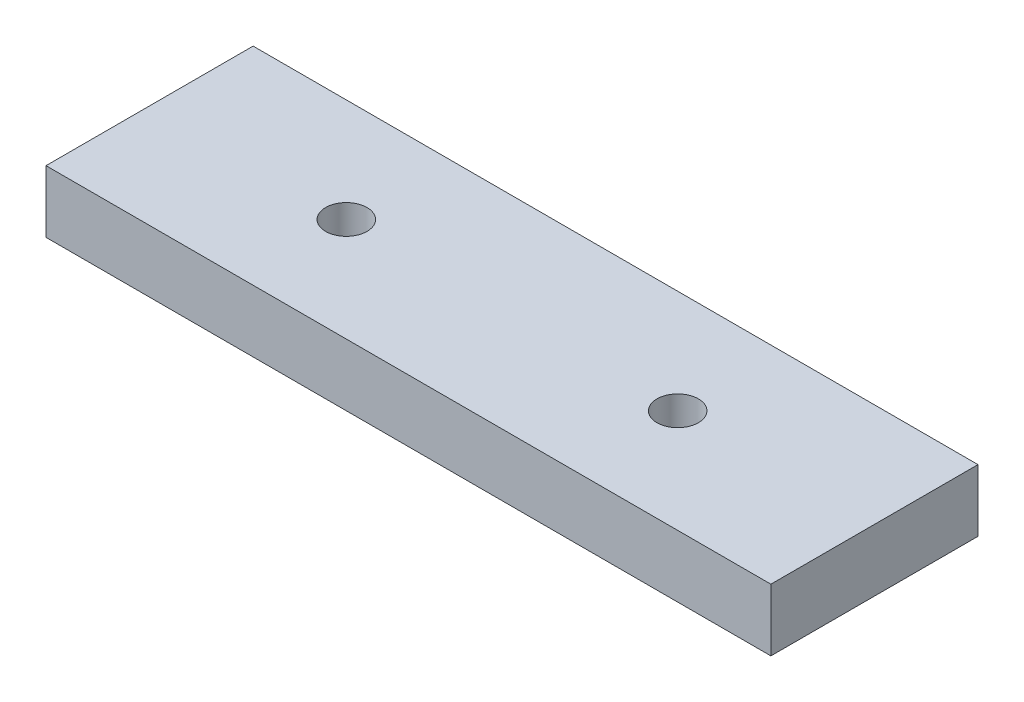
ISO-10303-21;
HEADER;
FILE_DESCRIPTION(('STEP AP214'),'2;1');
FILE_NAME('part.step','',(''),(''),'','','');
FILE_SCHEMA(('AUTOMOTIVE_DESIGN { 1 0 10303 214 1 1 1 1 }'));
ENDSEC;
DATA;
#1=APPLICATION_CONTEXT('core data for automotive mechanical design processes');
#2=APPLICATION_PROTOCOL_DEFINITION('international standard','automotive_design',2000,#1);
#3=PRODUCT_CONTEXT('',#1,'mechanical');
#4=PRODUCT('Part','Part','',(#3));
#5=PRODUCT_RELATED_PRODUCT_CATEGORY('part','',(#4));
#6=PRODUCT_DEFINITION_FORMATION('','',#4);
#7=PRODUCT_DEFINITION_CONTEXT('part definition',#1,'design');
#8=PRODUCT_DEFINITION('design','',#6,#7);
#9=PRODUCT_DEFINITION_SHAPE('','',#8);
#10=(LENGTH_UNIT() NAMED_UNIT(*) SI_UNIT(.MILLI.,.METRE.));
#11=(NAMED_UNIT(*) PLANE_ANGLE_UNIT() SI_UNIT($,.RADIAN.));
#12=(NAMED_UNIT(*) SI_UNIT($,.STERADIAN.) SOLID_ANGLE_UNIT());
#13=UNCERTAINTY_MEASURE_WITH_UNIT(LENGTH_MEASURE(1.E-05),#10,'distance_accuracy_value','');
#14=(GEOMETRIC_REPRESENTATION_CONTEXT(3) GLOBAL_UNCERTAINTY_ASSIGNED_CONTEXT((#13)) GLOBAL_UNIT_ASSIGNED_CONTEXT((#10,
#11,#12)) REPRESENTATION_CONTEXT('',''));
#15=CARTESIAN_POINT('',(0.,0.,0.));
#16=DIRECTION('',(0.,0.,1.));
#17=DIRECTION('',(1.,0.,0.));
#18=AXIS2_PLACEMENT_3D('',#15,#16,#17);
#19=CARTESIAN_POINT('',(17.5,1.5,4.99999999999999));
#20=DIRECTION('',(-1.,0.,0.));
#21=DIRECTION('',(0.,0.,1.));
#22=AXIS2_PLACEMENT_3D('',#19,#20,#21);
#23=PLANE('',#22);
#24=DIRECTION('',(0.,0.,-1.));
#25=VECTOR('',#24,1.);
#26=CARTESIAN_POINT('',(17.5,-1.5,4.99999999999999));
#27=LINE('',#26,#25);
#28=CARTESIAN_POINT('',(17.5,-1.5,4.99999999999999));
#29=VERTEX_POINT('',#28);
#30=CARTESIAN_POINT('',(17.5,-1.5,-4.99999999999999));
#31=VERTEX_POINT('',#30);
#32=EDGE_CURVE('E96',#29,#31,#27,.T.);
#33=ORIENTED_EDGE('',*,*,#32,.T.);
#34=DIRECTION('',(0.,-1.,0.));
#35=VECTOR('',#34,1.);
#36=CARTESIAN_POINT('',(17.5,1.5,-4.99999999999999));
#37=LINE('',#36,#35);
#38=CARTESIAN_POINT('',(17.5,1.5,-4.99999999999999));
#39=VERTEX_POINT('',#38);
#40=EDGE_CURVE('E11',#39,#31,#37,.T.);
#41=ORIENTED_EDGE('',*,*,#40,.F.);
#42=DIRECTION('',(0.,0.,-1.));
#43=VECTOR('',#42,1.);
#44=CARTESIAN_POINT('',(17.5,1.5,4.99999999999999));
#45=LINE('',#44,#43);
#46=CARTESIAN_POINT('',(17.5,1.5,4.99999999999999));
#47=VERTEX_POINT('',#46);
#48=EDGE_CURVE('E84',#47,#39,#45,.T.);
#49=ORIENTED_EDGE('',*,*,#48,.F.);
#50=DIRECTION('',(0.,-1.,0.));
#51=VECTOR('',#50,1.);
#52=CARTESIAN_POINT('',(17.5,1.5,4.99999999999999));
#53=LINE('',#52,#51);
#54=EDGE_CURVE('E92',#47,#29,#53,.T.);
#55=ORIENTED_EDGE('',*,*,#54,.T.);
#56=EDGE_LOOP('',(#33,#41,#49,#55));
#57=FACE_BOUND('',#56,.T.);
#58=ADVANCED_FACE('F33',(#57),#23,.F.);
#59=CARTESIAN_POINT('',(-17.5,1.5,-4.99999999999999));
#60=DIRECTION('',(0.,0.,1.));
#61=DIRECTION('',(1.,0.,0.));
#62=AXIS2_PLACEMENT_3D('',#59,#60,#61);
#63=PLANE('',#62);
#64=DIRECTION('',(-1.,0.,0.));
#65=VECTOR('',#64,1.);
#66=CARTESIAN_POINT('',(-17.5,-1.5,-4.99999999999999));
#67=LINE('',#66,#65);
#68=CARTESIAN_POINT('',(-17.5,-1.5,-4.99999999999999));
#69=VERTEX_POINT('',#68);
#70=EDGE_CURVE('E88',#31,#69,#67,.T.);
#71=ORIENTED_EDGE('',*,*,#70,.T.);
#72=DIRECTION('',(0.,-1.,0.));
#73=VECTOR('',#72,1.);
#74=CARTESIAN_POINT('',(-17.5,1.5,-4.99999999999999));
#75=LINE('',#74,#73);
#76=CARTESIAN_POINT('',(-17.5,1.5,-4.99999999999999));
#77=VERTEX_POINT('',#76);
#78=EDGE_CURVE('E41',#77,#69,#75,.T.);
#79=ORIENTED_EDGE('',*,*,#78,.F.);
#80=DIRECTION('',(-1.,0.,0.));
#81=VECTOR('',#80,1.);
#82=CARTESIAN_POINT('',(-17.5,1.5,-4.99999999999999));
#83=LINE('',#82,#81);
#84=EDGE_CURVE('E79',#39,#77,#83,.T.);
#85=ORIENTED_EDGE('',*,*,#84,.F.);
#86=ORIENTED_EDGE('',*,*,#40,.T.);
#87=EDGE_LOOP('',(#71,#79,#85,#86));
#88=FACE_BOUND('',#87,.T.);
#89=ADVANCED_FACE('F87',(#88),#63,.F.);
#90=CARTESIAN_POINT('',(-17.5,1.5,4.99999999999999));
#91=DIRECTION('',(1.,0.,0.));
#92=DIRECTION('',(0.,0.,-1.));
#93=AXIS2_PLACEMENT_3D('',#90,#91,#92);
#94=PLANE('',#93);
#95=DIRECTION('',(0.,0.,1.));
#96=VECTOR('',#95,1.);
#97=CARTESIAN_POINT('',(-17.5,-1.5,4.99999999999999));
#98=LINE('',#97,#96);
#99=CARTESIAN_POINT('',(-17.5,-1.5,4.99999999999999));
#100=VERTEX_POINT('',#99);
#101=EDGE_CURVE('E66',#69,#100,#98,.T.);
#102=ORIENTED_EDGE('',*,*,#101,.T.);
#103=DIRECTION('',(0.,-1.,0.));
#104=VECTOR('',#103,1.);
#105=CARTESIAN_POINT('',(-17.5,1.5,4.99999999999999));
#106=LINE('',#105,#104);
#107=CARTESIAN_POINT('',(-17.5,1.5,4.99999999999999));
#108=VERTEX_POINT('',#107);
#109=EDGE_CURVE('E89',#108,#100,#106,.T.);
#110=ORIENTED_EDGE('',*,*,#109,.F.);
#111=DIRECTION('',(0.,0.,1.));
#112=VECTOR('',#111,1.);
#113=CARTESIAN_POINT('',(-17.5,1.5,4.99999999999999));
#114=LINE('',#113,#112);
#115=EDGE_CURVE('E82',#77,#108,#114,.T.);
#116=ORIENTED_EDGE('',*,*,#115,.F.);
#117=ORIENTED_EDGE('',*,*,#78,.T.);
#118=EDGE_LOOP('',(#102,#110,#116,#117));
#119=FACE_BOUND('',#118,.T.);
#120=ADVANCED_FACE('F90',(#119),#94,.F.);
#121=CARTESIAN_POINT('',(-17.5,1.5,4.99999999999999));
#122=DIRECTION('',(0.,0.,-1.));
#123=DIRECTION('',(-1.,0.,0.));
#124=AXIS2_PLACEMENT_3D('',#121,#122,#123);
#125=PLANE('',#124);
#126=DIRECTION('',(1.,0.,0.));
#127=VECTOR('',#126,1.);
#128=CARTESIAN_POINT('',(-17.5,-1.5,4.99999999999999));
#129=LINE('',#128,#127);
#130=EDGE_CURVE('E72',#100,#29,#129,.T.);
#131=ORIENTED_EDGE('',*,*,#130,.T.);
#132=ORIENTED_EDGE('',*,*,#54,.F.);
#133=DIRECTION('',(1.,0.,0.));
#134=VECTOR('',#133,1.);
#135=CARTESIAN_POINT('',(-17.5,1.5,4.99999999999999));
#136=LINE('',#135,#134);
#137=EDGE_CURVE('E49',#108,#47,#136,.T.);
#138=ORIENTED_EDGE('',*,*,#137,.F.);
#139=ORIENTED_EDGE('',*,*,#109,.T.);
#140=EDGE_LOOP('',(#131,#132,#138,#139));
#141=FACE_BOUND('',#140,.T.);
#142=ADVANCED_FACE('F104',(#141),#125,.F.);
#143=CARTESIAN_POINT('',(0.,1.5,0.));
#144=DIRECTION('',(0.,-1.,0.));
#145=DIRECTION('',(0.,0.,-1.));
#146=AXIS2_PLACEMENT_3D('',#143,#144,#145);
#147=PLANE('',#146);
#148=CARTESIAN_POINT('',(8.,1.5,0.));
#149=DIRECTION('',(0.,1.,0.));
#150=DIRECTION('',(0.,0.,1.));
#151=AXIS2_PLACEMENT_3D('',#148,#149,#150);
#152=CIRCLE('',#151,1.);
#153=CARTESIAN_POINT('',(8.,1.5,1.));
#154=VERTEX_POINT('',#153);
#155=EDGE_CURVE('E116',#154,#154,#152,.T.);
#156=ORIENTED_EDGE('',*,*,#155,.F.);
#157=EDGE_LOOP('',(#156));
#158=FACE_BOUND('',#157,.T.);
#159=CARTESIAN_POINT('',(-8.,1.5,0.));
#160=DIRECTION('',(0.,1.,0.));
#161=DIRECTION('',(0.,0.,1.));
#162=AXIS2_PLACEMENT_3D('',#159,#160,#161);
#163=CIRCLE('',#162,0.999999999999999);
#164=CARTESIAN_POINT('',(-8.,1.5,0.999999999999999));
#165=VERTEX_POINT('',#164);
#166=EDGE_CURVE('E110',#165,#165,#163,.T.);
#167=ORIENTED_EDGE('',*,*,#166,.F.);
#168=EDGE_LOOP('',(#167));
#169=FACE_BOUND('',#168,.T.);
#170=ORIENTED_EDGE('',*,*,#48,.T.);
#171=ORIENTED_EDGE('',*,*,#84,.T.);
#172=ORIENTED_EDGE('',*,*,#115,.T.);
#173=ORIENTED_EDGE('',*,*,#137,.T.);
#174=EDGE_LOOP('',(#170,#171,#172,#173));
#175=FACE_BOUND('',#174,.T.);
#176=ADVANCED_FACE('F80',(#158,#169,#175),#147,.F.);
#177=CARTESIAN_POINT('',(0.,-1.5,0.));
#178=DIRECTION('',(0.,-1.,0.));
#179=DIRECTION('',(0.,0.,-1.));
#180=AXIS2_PLACEMENT_3D('',#177,#178,#179);
#181=PLANE('',#180);
#182=CARTESIAN_POINT('',(8.,-1.5,0.));
#183=DIRECTION('',(0.,1.,0.));
#184=DIRECTION('',(0.,0.,1.));
#185=AXIS2_PLACEMENT_3D('',#182,#183,#184);
#186=CIRCLE('',#185,1.);
#187=CARTESIAN_POINT('',(8.,-1.5,1.));
#188=VERTEX_POINT('',#187);
#189=EDGE_CURVE('E113',#188,#188,#186,.T.);
#190=ORIENTED_EDGE('',*,*,#189,.T.);
#191=EDGE_LOOP('',(#190));
#192=FACE_BOUND('',#191,.T.);
#193=CARTESIAN_POINT('',(-8.,-1.5,0.));
#194=DIRECTION('',(0.,1.,0.));
#195=DIRECTION('',(0.,0.,1.));
#196=AXIS2_PLACEMENT_3D('',#193,#194,#195);
#197=CIRCLE('',#196,0.999999999999999);
#198=CARTESIAN_POINT('',(-8.,-1.5,0.999999999999999));
#199=VERTEX_POINT('',#198);
#200=EDGE_CURVE('E99',#199,#199,#197,.T.);
#201=ORIENTED_EDGE('',*,*,#200,.T.);
#202=EDGE_LOOP('',(#201));
#203=FACE_BOUND('',#202,.T.);
#204=ORIENTED_EDGE('',*,*,#32,.F.);
#205=ORIENTED_EDGE('',*,*,#130,.F.);
#206=ORIENTED_EDGE('',*,*,#101,.F.);
#207=ORIENTED_EDGE('',*,*,#70,.F.);
#208=EDGE_LOOP('',(#204,#205,#206,#207));
#209=FACE_BOUND('',#208,.T.);
#210=ADVANCED_FACE('F107',(#192,#203,#209),#181,.T.);
#211=CARTESIAN_POINT('',(-8.,-1.5,0.));
#212=DIRECTION('',(0.,1.,0.));
#213=DIRECTION('',(0.,0.,1.));
#214=AXIS2_PLACEMENT_3D('',#211,#212,#213);
#215=CYLINDRICAL_SURFACE('',#214,0.999999999999999);
#216=ORIENTED_EDGE('',*,*,#200,.F.);
#217=EDGE_LOOP('',(#216));
#218=FACE_BOUND('',#217,.T.);
#219=ORIENTED_EDGE('',*,*,#166,.T.);
#220=EDGE_LOOP('',(#219));
#221=FACE_BOUND('',#220,.T.);
#222=ADVANCED_FACE('F127',(#218,#221),#215,.F.);
#223=CARTESIAN_POINT('',(8.,-1.5,0.));
#224=DIRECTION('',(0.,1.,0.));
#225=DIRECTION('',(0.,0.,1.));
#226=AXIS2_PLACEMENT_3D('',#223,#224,#225);
#227=CYLINDRICAL_SURFACE('',#226,1.);
#228=ORIENTED_EDGE('',*,*,#189,.F.);
#229=EDGE_LOOP('',(#228));
#230=FACE_BOUND('',#229,.T.);
#231=ORIENTED_EDGE('',*,*,#155,.T.);
#232=EDGE_LOOP('',(#231));
#233=FACE_BOUND('',#232,.T.);
#234=ADVANCED_FACE('F124',(#230,#233),#227,.F.);
#235=CLOSED_SHELL('',(#58,#89,#120,#142,#176,#210,#222,#234));
#236=MANIFOLD_SOLID_BREP('B2',#235);
#237=ADVANCED_BREP_SHAPE_REPRESENTATION('',(#18,#236),#14);
#238=SHAPE_DEFINITION_REPRESENTATION(#9,#237);
ENDSEC;
END-ISO-10303-21;
